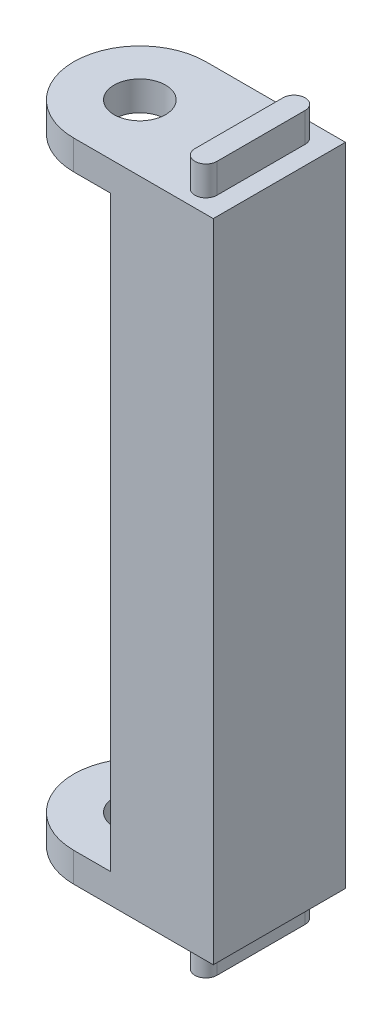
ISO-10303-21;
HEADER;
FILE_DESCRIPTION(('STEP AP214'),'2;1');
FILE_NAME('part.step','',(''),(''),'','','');
FILE_SCHEMA(('AUTOMOTIVE_DESIGN { 1 0 10303 214 1 1 1 1 }'));
ENDSEC;
DATA;
#1=APPLICATION_CONTEXT('core data for automotive mechanical design processes');
#2=APPLICATION_PROTOCOL_DEFINITION('international standard','automotive_design',2000,#1);
#3=PRODUCT_CONTEXT('',#1,'mechanical');
#4=PRODUCT('Part','Part','',(#3));
#5=PRODUCT_RELATED_PRODUCT_CATEGORY('part','',(#4));
#6=PRODUCT_DEFINITION_FORMATION('','',#4);
#7=PRODUCT_DEFINITION_CONTEXT('part definition',#1,'design');
#8=PRODUCT_DEFINITION('design','',#6,#7);
#9=PRODUCT_DEFINITION_SHAPE('','',#8);
#10=(LENGTH_UNIT() NAMED_UNIT(*) SI_UNIT(.MILLI.,.METRE.));
#11=(NAMED_UNIT(*) PLANE_ANGLE_UNIT() SI_UNIT($,.RADIAN.));
#12=(NAMED_UNIT(*) SI_UNIT($,.STERADIAN.) SOLID_ANGLE_UNIT());
#13=UNCERTAINTY_MEASURE_WITH_UNIT(LENGTH_MEASURE(1.E-05),#10,'distance_accuracy_value','');
#14=(GEOMETRIC_REPRESENTATION_CONTEXT(3) GLOBAL_UNCERTAINTY_ASSIGNED_CONTEXT((#13)) GLOBAL_UNIT_ASSIGNED_CONTEXT((#10,
#11,#12)) REPRESENTATION_CONTEXT('',''));
#15=CARTESIAN_POINT('',(0.,0.,0.));
#16=DIRECTION('',(0.,0.,1.));
#17=DIRECTION('',(1.,0.,0.));
#18=AXIS2_PLACEMENT_3D('',#15,#16,#17);
#19=CARTESIAN_POINT('',(0.,0.,0.));
#20=DIRECTION('',(0.,1.,0.));
#21=DIRECTION('',(0.,0.,1.));
#22=AXIS2_PLACEMENT_3D('',#19,#20,#21);
#23=PLANE('',#22);
#24=CARTESIAN_POINT('',(-2.5,0.,0.));
#25=DIRECTION('',(0.,1.,0.));
#26=DIRECTION('',(0.,0.,1.));
#27=AXIS2_PLACEMENT_3D('',#24,#25,#26);
#28=CIRCLE('',#27,1.75);
#29=CARTESIAN_POINT('',(-2.5,0.,1.75));
#30=VERTEX_POINT('',#29);
#31=EDGE_CURVE('E295',#30,#30,#28,.T.);
#32=ORIENTED_EDGE('',*,*,#31,.T.);
#33=EDGE_LOOP('',(#32));
#34=FACE_BOUND('',#33,.T.);
#35=DIRECTION('',(1.,0.,0.));
#36=VECTOR('',#35,1.);
#37=CARTESIAN_POINT('',(0.,0.,-4.5));
#38=LINE('',#37,#36);
#39=CARTESIAN_POINT('',(-2.5,0.,-4.5));
#40=VERTEX_POINT('',#39);
#41=CARTESIAN_POINT('',(0.00449595727363555,0.,-4.5));
#42=VERTEX_POINT('',#41);
#43=EDGE_CURVE('E313',#40,#42,#38,.T.);
#44=ORIENTED_EDGE('',*,*,#43,.T.);
#45=CARTESIAN_POINT('',(-2.5,0.,0.));
#46=DIRECTION('',(0.,1.,0.));
#47=DIRECTION('',(0.,0.,1.));
#48=AXIS2_PLACEMENT_3D('',#45,#46,#47);
#49=CIRCLE('',#48,5.15);
#50=CARTESIAN_POINT('',(0.00449595727363989,0.,4.5));
#51=VERTEX_POINT('',#50);
#52=EDGE_CURVE('E281',#42,#51,#49,.F.);
#53=ORIENTED_EDGE('',*,*,#52,.T.);
#54=DIRECTION('',(1.,0.,0.));
#55=VECTOR('',#54,1.);
#56=CARTESIAN_POINT('',(0.,0.,4.5));
#57=LINE('',#56,#55);
#58=CARTESIAN_POINT('',(-2.5,0.,4.5));
#59=VERTEX_POINT('',#58);
#60=EDGE_CURVE('E287',#59,#51,#57,.T.);
#61=ORIENTED_EDGE('',*,*,#60,.F.);
#62=CARTESIAN_POINT('',(-2.5,0.,0.));
#63=DIRECTION('',(0.,1.,0.));
#64=DIRECTION('',(0.,0.,1.));
#65=AXIS2_PLACEMENT_3D('',#62,#63,#64);
#66=CIRCLE('',#65,4.5);
#67=EDGE_CURVE('E317',#40,#59,#66,.T.);
#68=ORIENTED_EDGE('',*,*,#67,.F.);
#69=EDGE_LOOP('',(#44,#53,#61,#68));
#70=FACE_BOUND('',#69,.T.);
#71=ADVANCED_FACE('F41',(#34,#70),#23,.F.);
#72=CARTESIAN_POINT('',(0.,2.,4.5));
#73=DIRECTION('',(0.,0.,-1.));
#74=DIRECTION('',(-1.,0.,0.));
#75=AXIS2_PLACEMENT_3D('',#72,#73,#74);
#76=PLANE('',#75);
#77=ORIENTED_EDGE('',*,*,#60,.T.);
#78=DIRECTION('',(0.,1.,0.));
#79=VECTOR('',#78,1.);
#80=CARTESIAN_POINT('',(0.00449595727363989,-20.,4.5));
#81=LINE('',#80,#79);
#82=CARTESIAN_POINT('',(0.00449595727363989,-40.,4.5));
#83=VERTEX_POINT('',#82);
#84=EDGE_CURVE('E65',#83,#51,#81,.T.);
#85=ORIENTED_EDGE('',*,*,#84,.F.);
#86=DIRECTION('',(1.,0.,0.));
#87=VECTOR('',#86,1.);
#88=CARTESIAN_POINT('',(0.,-40.,4.5));
#89=LINE('',#88,#87);
#90=CARTESIAN_POINT('',(-2.5,-40.,4.5));
#91=VERTEX_POINT('',#90);
#92=EDGE_CURVE('E199',#91,#83,#89,.T.);
#93=ORIENTED_EDGE('',*,*,#92,.F.);
#94=DIRECTION('',(0.,1.,0.));
#95=VECTOR('',#94,1.);
#96=CARTESIAN_POINT('',(-2.5,-42.,4.5));
#97=LINE('',#96,#95);
#98=CARTESIAN_POINT('',(-2.5,-42.,4.5));
#99=VERTEX_POINT('',#98);
#100=EDGE_CURVE('E220',#99,#91,#97,.T.);
#101=ORIENTED_EDGE('',*,*,#100,.F.);
#102=DIRECTION('',(1.,0.,0.));
#103=VECTOR('',#102,1.);
#104=CARTESIAN_POINT('',(0.,-42.,4.5));
#105=LINE('',#104,#103);
#106=CARTESIAN_POINT('',(7.,-42.,4.5));
#107=VERTEX_POINT('',#106);
#108=EDGE_CURVE('E200',#99,#107,#105,.T.);
#109=ORIENTED_EDGE('',*,*,#108,.T.);
#110=DIRECTION('',(0.,-1.,0.));
#111=VECTOR('',#110,1.);
#112=CARTESIAN_POINT('',(7.,2.,4.5));
#113=LINE('',#112,#111);
#114=CARTESIAN_POINT('',(7.,2.,4.5));
#115=VERTEX_POINT('',#114);
#116=EDGE_CURVE('E332',#115,#107,#113,.T.);
#117=ORIENTED_EDGE('',*,*,#116,.F.);
#118=DIRECTION('',(1.,0.,0.));
#119=VECTOR('',#118,1.);
#120=CARTESIAN_POINT('',(0.,2.,4.5));
#121=LINE('',#120,#119);
#122=CARTESIAN_POINT('',(-2.5,2.,4.5));
#123=VERTEX_POINT('',#122);
#124=EDGE_CURVE('E290',#123,#115,#121,.T.);
#125=ORIENTED_EDGE('',*,*,#124,.F.);
#126=DIRECTION('',(0.,-1.,0.));
#127=VECTOR('',#126,1.);
#128=CARTESIAN_POINT('',(-2.5,2.,4.5));
#129=LINE('',#128,#127);
#130=EDGE_CURVE('E309',#123,#59,#129,.T.);
#131=ORIENTED_EDGE('',*,*,#130,.T.);
#132=EDGE_LOOP('',(#77,#85,#93,#101,#109,#117,#125,#131));
#133=FACE_BOUND('',#132,.T.);
#134=ADVANCED_FACE('F43',(#133),#76,.F.);
#135=CARTESIAN_POINT('',(7.,2.,0.));
#136=DIRECTION('',(-1.,0.,0.));
#137=DIRECTION('',(0.,0.,1.));
#138=AXIS2_PLACEMENT_3D('',#135,#136,#137);
#139=PLANE('',#138);
#140=ORIENTED_EDGE('',*,*,#116,.T.);
#141=DIRECTION('',(0.,0.,-1.));
#142=VECTOR('',#141,1.);
#143=CARTESIAN_POINT('',(7.,-42.,0.));
#144=LINE('',#143,#142);
#145=CARTESIAN_POINT('',(7.,-42.,-4.5));
#146=VERTEX_POINT('',#145);
#147=EDGE_CURVE('E204',#107,#146,#144,.T.);
#148=ORIENTED_EDGE('',*,*,#147,.T.);
#149=DIRECTION('',(0.,-1.,0.));
#150=VECTOR('',#149,1.);
#151=CARTESIAN_POINT('',(7.,2.,-4.5));
#152=LINE('',#151,#150);
#153=CARTESIAN_POINT('',(7.,2.,-4.5));
#154=VERTEX_POINT('',#153);
#155=EDGE_CURVE('E329',#154,#146,#152,.T.);
#156=ORIENTED_EDGE('',*,*,#155,.F.);
#157=DIRECTION('',(0.,0.,-1.));
#158=VECTOR('',#157,1.);
#159=CARTESIAN_POINT('',(7.,2.,0.));
#160=LINE('',#159,#158);
#161=EDGE_CURVE('E294',#115,#154,#160,.T.);
#162=ORIENTED_EDGE('',*,*,#161,.F.);
#163=EDGE_LOOP('',(#140,#148,#156,#162));
#164=FACE_BOUND('',#163,.T.);
#165=ADVANCED_FACE('F376',(#164),#139,.F.);
#166=CARTESIAN_POINT('',(0.,2.,-4.5));
#167=DIRECTION('',(0.,0.,-1.));
#168=DIRECTION('',(-1.,0.,0.));
#169=AXIS2_PLACEMENT_3D('',#166,#167,#168);
#170=PLANE('',#169);
#171=ORIENTED_EDGE('',*,*,#43,.F.);
#172=DIRECTION('',(0.,-1.,0.));
#173=VECTOR('',#172,1.);
#174=CARTESIAN_POINT('',(-2.5,2.,-4.5));
#175=LINE('',#174,#173);
#176=CARTESIAN_POINT('',(-2.5,2.,-4.5));
#177=VERTEX_POINT('',#176);
#178=EDGE_CURVE('E326',#177,#40,#175,.T.);
#179=ORIENTED_EDGE('',*,*,#178,.F.);
#180=DIRECTION('',(1.,0.,0.));
#181=VECTOR('',#180,1.);
#182=CARTESIAN_POINT('',(0.,2.,-4.5));
#183=LINE('',#182,#181);
#184=EDGE_CURVE('E298',#177,#154,#183,.T.);
#185=ORIENTED_EDGE('',*,*,#184,.T.);
#186=ORIENTED_EDGE('',*,*,#155,.T.);
#187=DIRECTION('',(1.,0.,0.));
#188=VECTOR('',#187,1.);
#189=CARTESIAN_POINT('',(0.,-42.,-4.5));
#190=LINE('',#189,#188);
#191=CARTESIAN_POINT('',(-2.5,-42.,-4.5));
#192=VERTEX_POINT('',#191);
#193=EDGE_CURVE('E209',#192,#146,#190,.T.);
#194=ORIENTED_EDGE('',*,*,#193,.F.);
#195=DIRECTION('',(0.,1.,0.));
#196=VECTOR('',#195,1.);
#197=CARTESIAN_POINT('',(-2.5,-42.,-4.5));
#198=LINE('',#197,#196);
#199=CARTESIAN_POINT('',(-2.5,-40.,-4.5));
#200=VERTEX_POINT('',#199);
#201=EDGE_CURVE('E237',#192,#200,#198,.T.);
#202=ORIENTED_EDGE('',*,*,#201,.T.);
#203=DIRECTION('',(1.,0.,0.));
#204=VECTOR('',#203,1.);
#205=CARTESIAN_POINT('',(0.,-40.,-4.5));
#206=LINE('',#205,#204);
#207=CARTESIAN_POINT('',(0.00449595727363555,-40.,-4.5));
#208=VERTEX_POINT('',#207);
#209=EDGE_CURVE('E224',#200,#208,#206,.T.);
#210=ORIENTED_EDGE('',*,*,#209,.T.);
#211=DIRECTION('',(0.,1.,0.));
#212=VECTOR('',#211,1.);
#213=CARTESIAN_POINT('',(0.00449595727363555,-20.,-4.5));
#214=LINE('',#213,#212);
#215=EDGE_CURVE('E284',#208,#42,#214,.T.);
#216=ORIENTED_EDGE('',*,*,#215,.T.);
#217=EDGE_LOOP('',(#171,#179,#185,#186,#194,#202,#210,#216));
#218=FACE_BOUND('',#217,.T.);
#219=ADVANCED_FACE('F389',(#218),#170,.T.);
#220=CARTESIAN_POINT('',(-2.5,2.,0.));
#221=DIRECTION('',(0.,-1.,0.));
#222=DIRECTION('',(0.,0.,-1.));
#223=AXIS2_PLACEMENT_3D('',#220,#221,#222);
#224=CYLINDRICAL_SURFACE('',#223,4.5);
#225=ORIENTED_EDGE('',*,*,#67,.T.);
#226=ORIENTED_EDGE('',*,*,#130,.F.);
#227=CARTESIAN_POINT('',(-2.5,2.,0.));
#228=DIRECTION('',(0.,1.,0.));
#229=DIRECTION('',(0.,0.,1.));
#230=AXIS2_PLACEMENT_3D('',#227,#228,#229);
#231=CIRCLE('',#230,4.5);
#232=EDGE_CURVE('E302',#177,#123,#231,.T.);
#233=ORIENTED_EDGE('',*,*,#232,.F.);
#234=ORIENTED_EDGE('',*,*,#178,.T.);
#235=EDGE_LOOP('',(#225,#226,#233,#234));
#236=FACE_BOUND('',#235,.T.);
#237=ADVANCED_FACE('F385',(#236),#224,.T.);
#238=CARTESIAN_POINT('',(-2.5,2.,0.));
#239=DIRECTION('',(0.,-1.,0.));
#240=DIRECTION('',(0.,0.,-1.));
#241=AXIS2_PLACEMENT_3D('',#238,#239,#240);
#242=CYLINDRICAL_SURFACE('',#241,1.75);
#243=CARTESIAN_POINT('',(-2.5,2.,0.));
#244=DIRECTION('',(0.,1.,0.));
#245=DIRECTION('',(0.,0.,1.));
#246=AXIS2_PLACEMENT_3D('',#243,#244,#245);
#247=CIRCLE('',#246,1.75);
#248=CARTESIAN_POINT('',(-2.5,2.,1.75));
#249=VERTEX_POINT('',#248);
#250=EDGE_CURVE('E305',#249,#249,#247,.T.);
#251=ORIENTED_EDGE('',*,*,#250,.T.);
#252=EDGE_LOOP('',(#251));
#253=FACE_BOUND('',#252,.T.);
#254=ORIENTED_EDGE('',*,*,#31,.F.);
#255=EDGE_LOOP('',(#254));
#256=FACE_BOUND('',#255,.T.);
#257=ADVANCED_FACE('F382',(#253,#256),#242,.F.);
#258=CARTESIAN_POINT('',(0.,2.,0.));
#259=DIRECTION('',(0.,1.,0.));
#260=DIRECTION('',(0.,0.,1.));
#261=AXIS2_PLACEMENT_3D('',#258,#259,#260);
#262=PLANE('',#261);
#263=CARTESIAN_POINT('',(5.,2.,3.));
#264=DIRECTION('',(0.,1.,0.));
#265=DIRECTION('',(0.,0.,1.));
#266=AXIS2_PLACEMENT_3D('',#263,#264,#265);
#267=CIRCLE('',#266,0.749999999999999);
#268=CARTESIAN_POINT('',(5.75,2.,3.));
#269=VERTEX_POINT('',#268);
#270=CARTESIAN_POINT('',(4.25,2.,3.));
#271=VERTEX_POINT('',#270);
#272=EDGE_CURVE('E50',#269,#271,#267,.F.);
#273=ORIENTED_EDGE('',*,*,#272,.T.);
#274=DIRECTION('',(0.,0.,-1.));
#275=VECTOR('',#274,1.);
#276=CARTESIAN_POINT('',(4.25,2.,0.));
#277=LINE('',#276,#275);
#278=CARTESIAN_POINT('',(4.25,2.,-3.));
#279=VERTEX_POINT('',#278);
#280=EDGE_CURVE('E11',#271,#279,#277,.T.);
#281=ORIENTED_EDGE('',*,*,#280,.T.);
#282=CARTESIAN_POINT('',(5.,2.,-3.));
#283=DIRECTION('',(0.,1.,0.));
#284=DIRECTION('',(0.,0.,1.));
#285=AXIS2_PLACEMENT_3D('',#282,#283,#284);
#286=CIRCLE('',#285,0.749999999999999);
#287=CARTESIAN_POINT('',(5.75,2.,-3.));
#288=VERTEX_POINT('',#287);
#289=EDGE_CURVE('E335',#279,#288,#286,.F.);
#290=ORIENTED_EDGE('',*,*,#289,.T.);
#291=DIRECTION('',(0.,0.,-1.));
#292=VECTOR('',#291,1.);
#293=CARTESIAN_POINT('',(5.75,2.,0.));
#294=LINE('',#293,#292);
#295=EDGE_CURVE('E339',#269,#288,#294,.T.);
#296=ORIENTED_EDGE('',*,*,#295,.F.);
#297=EDGE_LOOP('',(#273,#281,#290,#296));
#298=FACE_BOUND('',#297,.T.);
#299=ORIENTED_EDGE('',*,*,#124,.T.);
#300=ORIENTED_EDGE('',*,*,#161,.T.);
#301=ORIENTED_EDGE('',*,*,#184,.F.);
#302=ORIENTED_EDGE('',*,*,#232,.T.);
#303=EDGE_LOOP('',(#299,#300,#301,#302));
#304=FACE_BOUND('',#303,.T.);
#305=ORIENTED_EDGE('',*,*,#250,.F.);
#306=EDGE_LOOP('',(#305));
#307=FACE_BOUND('',#306,.T.);
#308=ADVANCED_FACE('F345',(#298,#304,#307),#262,.T.);
#309=CARTESIAN_POINT('',(-2.5,-20.,0.));
#310=DIRECTION('',(0.,1.,0.));
#311=DIRECTION('',(0.,0.,1.));
#312=AXIS2_PLACEMENT_3D('',#309,#310,#311);
#313=CYLINDRICAL_SURFACE('',#312,5.15);
#314=ORIENTED_EDGE('',*,*,#52,.F.);
#315=ORIENTED_EDGE('',*,*,#215,.F.);
#316=CARTESIAN_POINT('',(-2.5,-40.,0.));
#317=DIRECTION('',(0.,1.,0.));
#318=DIRECTION('',(0.,0.,1.));
#319=AXIS2_PLACEMENT_3D('',#316,#317,#318);
#320=CIRCLE('',#319,5.15);
#321=EDGE_CURVE('E177',#208,#83,#320,.F.);
#322=ORIENTED_EDGE('',*,*,#321,.T.);
#323=ORIENTED_EDGE('',*,*,#84,.T.);
#324=EDGE_LOOP('',(#314,#315,#322,#323));
#325=FACE_BOUND('',#324,.T.);
#326=ADVANCED_FACE('F420',(#325),#313,.F.);
#327=CARTESIAN_POINT('',(4.25,4.,0.));
#328=DIRECTION('',(1.,0.,0.));
#329=DIRECTION('',(0.,0.,-1.));
#330=AXIS2_PLACEMENT_3D('',#327,#328,#329);
#331=PLANE('',#330);
#332=ORIENTED_EDGE('',*,*,#280,.F.);
#333=DIRECTION('',(0.,-1.,0.));
#334=VECTOR('',#333,1.);
#335=CARTESIAN_POINT('',(4.25,4.,3.));
#336=LINE('',#335,#334);
#337=CARTESIAN_POINT('',(4.25,4.,3.));
#338=VERTEX_POINT('',#337);
#339=EDGE_CURVE('E277',#338,#271,#336,.T.);
#340=ORIENTED_EDGE('',*,*,#339,.F.);
#341=DIRECTION('',(0.,0.,1.));
#342=VECTOR('',#341,1.);
#343=CARTESIAN_POINT('',(4.25,4.,0.));
#344=LINE('',#343,#342);
#345=CARTESIAN_POINT('',(4.25,4.,-3.));
#346=VERTEX_POINT('',#345);
#347=EDGE_CURVE('E253',#346,#338,#344,.T.);
#348=ORIENTED_EDGE('',*,*,#347,.F.);
#349=DIRECTION('',(0.,-1.,0.));
#350=VECTOR('',#349,1.);
#351=CARTESIAN_POINT('',(4.25,4.,-3.));
#352=LINE('',#351,#350);
#353=EDGE_CURVE('E267',#346,#279,#352,.T.);
#354=ORIENTED_EDGE('',*,*,#353,.T.);
#355=EDGE_LOOP('',(#332,#340,#348,#354));
#356=FACE_BOUND('',#355,.T.);
#357=ADVANCED_FACE('F359',(#356),#331,.F.);
#358=CARTESIAN_POINT('',(5.,4.,3.));
#359=DIRECTION('',(0.,-1.,0.));
#360=DIRECTION('',(0.,0.,-1.));
#361=AXIS2_PLACEMENT_3D('',#358,#359,#360);
#362=CYLINDRICAL_SURFACE('',#361,0.749999999999999);
#363=ORIENTED_EDGE('',*,*,#272,.F.);
#364=DIRECTION('',(0.,-1.,0.));
#365=VECTOR('',#364,1.);
#366=CARTESIAN_POINT('',(5.75,4.,3.));
#367=LINE('',#366,#365);
#368=CARTESIAN_POINT('',(5.75,4.,3.));
#369=VERTEX_POINT('',#368);
#370=EDGE_CURVE('E273',#369,#269,#367,.T.);
#371=ORIENTED_EDGE('',*,*,#370,.F.);
#372=CARTESIAN_POINT('',(5.,4.,3.));
#373=DIRECTION('',(0.,1.,0.));
#374=DIRECTION('',(0.,0.,1.));
#375=AXIS2_PLACEMENT_3D('',#372,#373,#374);
#376=CIRCLE('',#375,0.749999999999999);
#377=EDGE_CURVE('E257',#338,#369,#376,.T.);
#378=ORIENTED_EDGE('',*,*,#377,.F.);
#379=ORIENTED_EDGE('',*,*,#339,.T.);
#380=EDGE_LOOP('',(#363,#371,#378,#379));
#381=FACE_BOUND('',#380,.T.);
#382=ADVANCED_FACE('F349',(#381),#362,.T.);
#383=CARTESIAN_POINT('',(5.75,4.,0.));
#384=DIRECTION('',(1.,0.,0.));
#385=DIRECTION('',(0.,0.,-1.));
#386=AXIS2_PLACEMENT_3D('',#383,#384,#385);
#387=PLANE('',#386);
#388=ORIENTED_EDGE('',*,*,#370,.T.);
#389=ORIENTED_EDGE('',*,*,#295,.T.);
#390=DIRECTION('',(0.,-1.,0.));
#391=VECTOR('',#390,1.);
#392=CARTESIAN_POINT('',(5.75,4.,-3.));
#393=LINE('',#392,#391);
#394=CARTESIAN_POINT('',(5.75,4.,-3.));
#395=VERTEX_POINT('',#394);
#396=EDGE_CURVE('E57',#395,#288,#393,.T.);
#397=ORIENTED_EDGE('',*,*,#396,.F.);
#398=DIRECTION('',(0.,0.,1.));
#399=VECTOR('',#398,1.);
#400=CARTESIAN_POINT('',(5.75,4.,0.));
#401=LINE('',#400,#399);
#402=EDGE_CURVE('E260',#395,#369,#401,.T.);
#403=ORIENTED_EDGE('',*,*,#402,.T.);
#404=EDGE_LOOP('',(#388,#389,#397,#403));
#405=FACE_BOUND('',#404,.T.);
#406=ADVANCED_FACE('F352',(#405),#387,.T.);
#407=CARTESIAN_POINT('',(5.,4.,-3.));
#408=DIRECTION('',(0.,-1.,0.));
#409=DIRECTION('',(0.,0.,-1.));
#410=AXIS2_PLACEMENT_3D('',#407,#408,#409);
#411=CYLINDRICAL_SURFACE('',#410,0.749999999999999);
#412=ORIENTED_EDGE('',*,*,#289,.F.);
#413=ORIENTED_EDGE('',*,*,#353,.F.);
#414=CARTESIAN_POINT('',(5.,4.,-3.));
#415=DIRECTION('',(0.,1.,0.));
#416=DIRECTION('',(0.,0.,1.));
#417=AXIS2_PLACEMENT_3D('',#414,#415,#416);
#418=CIRCLE('',#417,0.749999999999999);
#419=EDGE_CURVE('E264',#395,#346,#418,.T.);
#420=ORIENTED_EDGE('',*,*,#419,.F.);
#421=ORIENTED_EDGE('',*,*,#396,.T.);
#422=EDGE_LOOP('',(#412,#413,#420,#421));
#423=FACE_BOUND('',#422,.T.);
#424=ADVANCED_FACE('F360',(#423),#411,.T.);
#425=CARTESIAN_POINT('',(0.,4.,0.));
#426=DIRECTION('',(0.,1.,0.));
#427=DIRECTION('',(0.,0.,1.));
#428=AXIS2_PLACEMENT_3D('',#425,#426,#427);
#429=PLANE('',#428);
#430=ORIENTED_EDGE('',*,*,#347,.T.);
#431=ORIENTED_EDGE('',*,*,#377,.T.);
#432=ORIENTED_EDGE('',*,*,#402,.F.);
#433=ORIENTED_EDGE('',*,*,#419,.T.);
#434=EDGE_LOOP('',(#430,#431,#432,#433));
#435=FACE_BOUND('',#434,.T.);
#436=ADVANCED_FACE('F355',(#435),#429,.T.);
#437=CARTESIAN_POINT('',(0.,-40.,0.));
#438=DIRECTION('',(0.,-1.,0.));
#439=DIRECTION('',(0.,0.,1.));
#440=AXIS2_PLACEMENT_3D('',#437,#438,#439);
#441=PLANE('',#440);
#442=CARTESIAN_POINT('',(-2.5,-40.,0.));
#443=DIRECTION('',(0.,1.,0.));
#444=DIRECTION('',(0.,0.,1.));
#445=AXIS2_PLACEMENT_3D('',#442,#443,#444);
#446=CIRCLE('',#445,1.75);
#447=CARTESIAN_POINT('',(-2.5,-40.,1.75));
#448=VERTEX_POINT('',#447);
#449=EDGE_CURVE('E205',#448,#448,#446,.T.);
#450=ORIENTED_EDGE('',*,*,#449,.F.);
#451=EDGE_LOOP('',(#450));
#452=FACE_BOUND('',#451,.T.);
#453=ORIENTED_EDGE('',*,*,#209,.F.);
#454=CARTESIAN_POINT('',(-2.5,-40.,0.));
#455=DIRECTION('',(0.,1.,0.));
#456=DIRECTION('',(0.,0.,1.));
#457=AXIS2_PLACEMENT_3D('',#454,#455,#456);
#458=CIRCLE('',#457,4.5);
#459=EDGE_CURVE('E228',#200,#91,#458,.T.);
#460=ORIENTED_EDGE('',*,*,#459,.T.);
#461=ORIENTED_EDGE('',*,*,#92,.T.);
#462=ORIENTED_EDGE('',*,*,#321,.F.);
#463=EDGE_LOOP('',(#453,#460,#461,#462));
#464=FACE_BOUND('',#463,.T.);
#465=ADVANCED_FACE('F367',(#452,#464),#441,.F.);
#466=CARTESIAN_POINT('',(-2.5,-42.,0.));
#467=DIRECTION('',(0.,1.,0.));
#468=DIRECTION('',(0.,0.,-1.));
#469=AXIS2_PLACEMENT_3D('',#466,#467,#468);
#470=CYLINDRICAL_SURFACE('',#469,4.5);
#471=ORIENTED_EDGE('',*,*,#459,.F.);
#472=ORIENTED_EDGE('',*,*,#201,.F.);
#473=CARTESIAN_POINT('',(-2.5,-42.,0.));
#474=DIRECTION('',(0.,1.,0.));
#475=DIRECTION('',(0.,0.,1.));
#476=AXIS2_PLACEMENT_3D('',#473,#474,#475);
#477=CIRCLE('',#476,4.5);
#478=EDGE_CURVE('E213',#192,#99,#477,.T.);
#479=ORIENTED_EDGE('',*,*,#478,.T.);
#480=ORIENTED_EDGE('',*,*,#100,.T.);
#481=EDGE_LOOP('',(#471,#472,#479,#480));
#482=FACE_BOUND('',#481,.T.);
#483=ADVANCED_FACE('F410',(#482),#470,.T.);
#484=CARTESIAN_POINT('',(-2.5,-42.,0.));
#485=DIRECTION('',(0.,1.,0.));
#486=DIRECTION('',(0.,0.,-1.));
#487=AXIS2_PLACEMENT_3D('',#484,#485,#486);
#488=CYLINDRICAL_SURFACE('',#487,1.75);
#489=CARTESIAN_POINT('',(-2.5,-42.,0.));
#490=DIRECTION('',(0.,1.,0.));
#491=DIRECTION('',(0.,0.,1.));
#492=AXIS2_PLACEMENT_3D('',#489,#490,#491);
#493=CIRCLE('',#492,1.75);
#494=CARTESIAN_POINT('',(-2.5,-42.,1.75));
#495=VERTEX_POINT('',#494);
#496=EDGE_CURVE('E216',#495,#495,#493,.T.);
#497=ORIENTED_EDGE('',*,*,#496,.F.);
#498=EDGE_LOOP('',(#497));
#499=FACE_BOUND('',#498,.T.);
#500=ORIENTED_EDGE('',*,*,#449,.T.);
#501=EDGE_LOOP('',(#500));
#502=FACE_BOUND('',#501,.T.);
#503=ADVANCED_FACE('F429',(#499,#502),#488,.F.);
#504=CARTESIAN_POINT('',(0.,-42.,0.));
#505=DIRECTION('',(0.,-1.,0.));
#506=DIRECTION('',(0.,0.,1.));
#507=AXIS2_PLACEMENT_3D('',#504,#505,#506);
#508=PLANE('',#507);
#509=CARTESIAN_POINT('',(5.,-42.,3.));
#510=DIRECTION('',(0.,1.,0.));
#511=DIRECTION('',(0.,0.,1.));
#512=AXIS2_PLACEMENT_3D('',#509,#510,#511);
#513=CIRCLE('',#512,0.749999999999999);
#514=CARTESIAN_POINT('',(5.75,-42.,3.));
#515=VERTEX_POINT('',#514);
#516=CARTESIAN_POINT('',(4.25,-42.,3.));
#517=VERTEX_POINT('',#516);
#518=EDGE_CURVE('E172',#515,#517,#513,.F.);
#519=ORIENTED_EDGE('',*,*,#518,.F.);
#520=DIRECTION('',(0.,0.,-1.));
#521=VECTOR('',#520,1.);
#522=CARTESIAN_POINT('',(5.75,-42.,0.));
#523=LINE('',#522,#521);
#524=CARTESIAN_POINT('',(5.75,-42.,-3.));
#525=VERTEX_POINT('',#524);
#526=EDGE_CURVE('E244',#515,#525,#523,.T.);
#527=ORIENTED_EDGE('',*,*,#526,.T.);
#528=CARTESIAN_POINT('',(5.,-42.,-3.));
#529=DIRECTION('',(0.,1.,0.));
#530=DIRECTION('',(0.,0.,1.));
#531=AXIS2_PLACEMENT_3D('',#528,#529,#530);
#532=CIRCLE('',#531,0.749999999999999);
#533=CARTESIAN_POINT('',(4.25,-42.,-3.));
#534=VERTEX_POINT('',#533);
#535=EDGE_CURVE('E240',#534,#525,#532,.F.);
#536=ORIENTED_EDGE('',*,*,#535,.F.);
#537=DIRECTION('',(0.,0.,-1.));
#538=VECTOR('',#537,1.);
#539=CARTESIAN_POINT('',(4.25,-42.,0.));
#540=LINE('',#539,#538);
#541=EDGE_CURVE('E250',#517,#534,#540,.T.);
#542=ORIENTED_EDGE('',*,*,#541,.F.);
#543=EDGE_LOOP('',(#519,#527,#536,#542));
#544=FACE_BOUND('',#543,.T.);
#545=ORIENTED_EDGE('',*,*,#108,.F.);
#546=ORIENTED_EDGE('',*,*,#478,.F.);
#547=ORIENTED_EDGE('',*,*,#193,.T.);
#548=ORIENTED_EDGE('',*,*,#147,.F.);
#549=EDGE_LOOP('',(#545,#546,#547,#548));
#550=FACE_BOUND('',#549,.T.);
#551=ORIENTED_EDGE('',*,*,#496,.T.);
#552=EDGE_LOOP('',(#551));
#553=FACE_BOUND('',#552,.T.);
#554=ADVANCED_FACE('F403',(#544,#550,#553),#508,.T.);
#555=CARTESIAN_POINT('',(4.25,-44.,0.));
#556=DIRECTION('',(1.,0.,0.));
#557=DIRECTION('',(0.,0.,-1.));
#558=AXIS2_PLACEMENT_3D('',#555,#556,#557);
#559=PLANE('',#558);
#560=ORIENTED_EDGE('',*,*,#541,.T.);
#561=DIRECTION('',(0.,1.,0.));
#562=VECTOR('',#561,1.);
#563=CARTESIAN_POINT('',(4.25,-44.,-3.));
#564=LINE('',#563,#562);
#565=CARTESIAN_POINT('',(4.25,-44.,-3.));
#566=VERTEX_POINT('',#565);
#567=EDGE_CURVE('E181',#566,#534,#564,.T.);
#568=ORIENTED_EDGE('',*,*,#567,.F.);
#569=DIRECTION('',(0.,0.,1.));
#570=VECTOR('',#569,1.);
#571=CARTESIAN_POINT('',(4.25,-44.,0.));
#572=LINE('',#571,#570);
#573=CARTESIAN_POINT('',(4.25,-44.,3.));
#574=VERTEX_POINT('',#573);
#575=EDGE_CURVE('E160',#566,#574,#572,.T.);
#576=ORIENTED_EDGE('',*,*,#575,.T.);
#577=DIRECTION('',(0.,1.,0.));
#578=VECTOR('',#577,1.);
#579=CARTESIAN_POINT('',(4.25,-44.,3.));
#580=LINE('',#579,#578);
#581=EDGE_CURVE('E169',#574,#517,#580,.T.);
#582=ORIENTED_EDGE('',*,*,#581,.T.);
#583=EDGE_LOOP('',(#560,#568,#576,#582));
#584=FACE_BOUND('',#583,.T.);
#585=ADVANCED_FACE('F180',(#584),#559,.F.);
#586=CARTESIAN_POINT('',(5.,-44.,3.));
#587=DIRECTION('',(0.,1.,0.));
#588=DIRECTION('',(0.,0.,-1.));
#589=AXIS2_PLACEMENT_3D('',#586,#587,#588);
#590=CYLINDRICAL_SURFACE('',#589,0.749999999999999);
#591=ORIENTED_EDGE('',*,*,#518,.T.);
#592=ORIENTED_EDGE('',*,*,#581,.F.);
#593=CARTESIAN_POINT('',(5.,-44.,3.));
#594=DIRECTION('',(0.,1.,0.));
#595=DIRECTION('',(0.,0.,1.));
#596=AXIS2_PLACEMENT_3D('',#593,#594,#595);
#597=CIRCLE('',#596,0.749999999999999);
#598=CARTESIAN_POINT('',(5.75,-44.,3.));
#599=VERTEX_POINT('',#598);
#600=EDGE_CURVE('E156',#574,#599,#597,.T.);
#601=ORIENTED_EDGE('',*,*,#600,.T.);
#602=DIRECTION('',(0.,1.,0.));
#603=VECTOR('',#602,1.);
#604=CARTESIAN_POINT('',(5.75,-44.,3.));
#605=LINE('',#604,#603);
#606=EDGE_CURVE('E178',#599,#515,#605,.T.);
#607=ORIENTED_EDGE('',*,*,#606,.T.);
#608=EDGE_LOOP('',(#591,#592,#601,#607));
#609=FACE_BOUND('',#608,.T.);
#610=ADVANCED_FACE('F170',(#609),#590,.T.);
#611=CARTESIAN_POINT('',(5.75,-44.,0.));
#612=DIRECTION('',(1.,0.,0.));
#613=DIRECTION('',(0.,0.,-1.));
#614=AXIS2_PLACEMENT_3D('',#611,#612,#613);
#615=PLANE('',#614);
#616=ORIENTED_EDGE('',*,*,#606,.F.);
#617=DIRECTION('',(0.,0.,1.));
#618=VECTOR('',#617,1.);
#619=CARTESIAN_POINT('',(5.75,-44.,0.));
#620=LINE('',#619,#618);
#621=CARTESIAN_POINT('',(5.75,-44.,-3.));
#622=VERTEX_POINT('',#621);
#623=EDGE_CURVE('E163',#622,#599,#620,.T.);
#624=ORIENTED_EDGE('',*,*,#623,.F.);
#625=DIRECTION('',(0.,1.,0.));
#626=VECTOR('',#625,1.);
#627=CARTESIAN_POINT('',(5.75,-44.,-3.));
#628=LINE('',#627,#626);
#629=EDGE_CURVE('E192',#622,#525,#628,.T.);
#630=ORIENTED_EDGE('',*,*,#629,.T.);
#631=ORIENTED_EDGE('',*,*,#526,.F.);
#632=EDGE_LOOP('',(#616,#624,#630,#631));
#633=FACE_BOUND('',#632,.T.);
#634=ADVANCED_FACE('F452',(#633),#615,.T.);
#635=CARTESIAN_POINT('',(5.,-44.,-3.));
#636=DIRECTION('',(0.,1.,0.));
#637=DIRECTION('',(0.,0.,-1.));
#638=AXIS2_PLACEMENT_3D('',#635,#636,#637);
#639=CYLINDRICAL_SURFACE('',#638,0.749999999999999);
#640=ORIENTED_EDGE('',*,*,#535,.T.);
#641=ORIENTED_EDGE('',*,*,#629,.F.);
#642=CARTESIAN_POINT('',(5.,-44.,-3.));
#643=DIRECTION('',(0.,1.,0.));
#644=DIRECTION('',(0.,0.,1.));
#645=AXIS2_PLACEMENT_3D('',#642,#643,#644);
#646=CIRCLE('',#645,0.749999999999999);
#647=EDGE_CURVE('E187',#622,#566,#646,.T.);
#648=ORIENTED_EDGE('',*,*,#647,.T.);
#649=ORIENTED_EDGE('',*,*,#567,.T.);
#650=EDGE_LOOP('',(#640,#641,#648,#649));
#651=FACE_BOUND('',#650,.T.);
#652=ADVANCED_FACE('F450',(#651),#639,.T.);
#653=CARTESIAN_POINT('',(0.,-44.,0.));
#654=DIRECTION('',(0.,-1.,0.));
#655=DIRECTION('',(0.,0.,1.));
#656=AXIS2_PLACEMENT_3D('',#653,#654,#655);
#657=PLANE('',#656);
#658=ORIENTED_EDGE('',*,*,#575,.F.);
#659=ORIENTED_EDGE('',*,*,#647,.F.);
#660=ORIENTED_EDGE('',*,*,#623,.T.);
#661=ORIENTED_EDGE('',*,*,#600,.F.);
#662=EDGE_LOOP('',(#658,#659,#660,#661));
#663=FACE_BOUND('',#662,.T.);
#664=ADVANCED_FACE('F158',(#663),#657,.T.);
#665=CLOSED_SHELL('',(#71,#134,#165,#219,#237,#257,#308,#326,#357,#382,#406,#424,#436,#465,#483,
#503,#554,#585,#610,#634,#652,#664));
#666=MANIFOLD_SOLID_BREP('B2',#665);
#667=ADVANCED_BREP_SHAPE_REPRESENTATION('',(#18,#666),#14);
#668=SHAPE_DEFINITION_REPRESENTATION(#9,#667);
ENDSEC;
END-ISO-10303-21;
